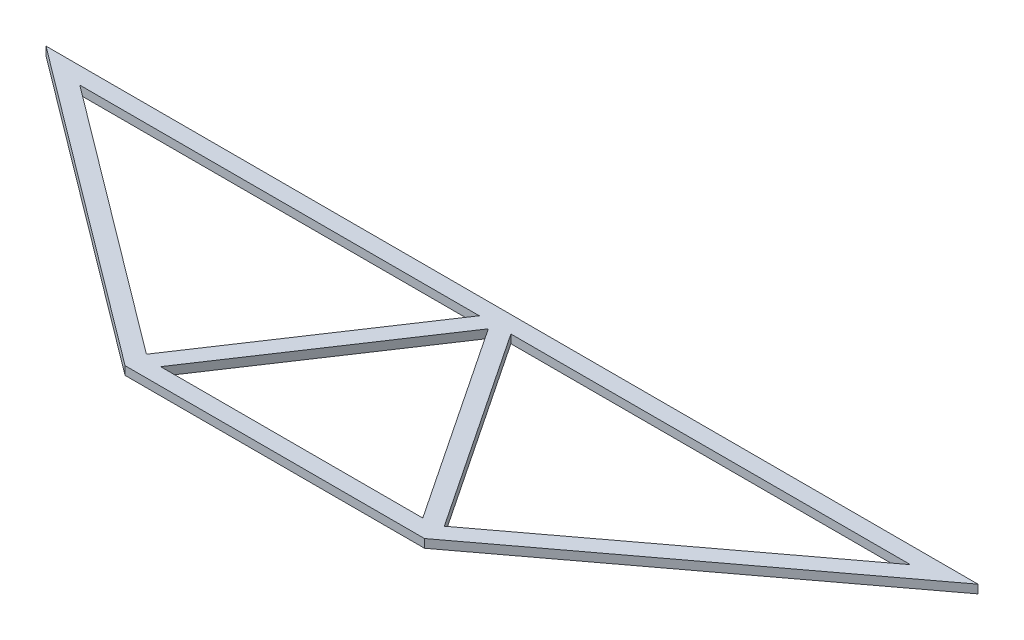
ISO-10303-21;
HEADER;
FILE_DESCRIPTION(('STEP AP214'),'2;1');
FILE_NAME('part.step','',(''),(''),'','','');
FILE_SCHEMA(('AUTOMOTIVE_DESIGN { 1 0 10303 214 1 1 1 1 }'));
ENDSEC;
DATA;
#1=APPLICATION_CONTEXT('core data for automotive mechanical design processes');
#2=APPLICATION_PROTOCOL_DEFINITION('international standard','automotive_design',2000,#1);
#3=PRODUCT_CONTEXT('',#1,'mechanical');
#4=PRODUCT('Part','Part','',(#3));
#5=PRODUCT_RELATED_PRODUCT_CATEGORY('part','',(#4));
#6=PRODUCT_DEFINITION_FORMATION('','',#4);
#7=PRODUCT_DEFINITION_CONTEXT('part definition',#1,'design');
#8=PRODUCT_DEFINITION('design','',#6,#7);
#9=PRODUCT_DEFINITION_SHAPE('','',#8);
#10=(LENGTH_UNIT() NAMED_UNIT(*) SI_UNIT(.MILLI.,.METRE.));
#11=(NAMED_UNIT(*) PLANE_ANGLE_UNIT() SI_UNIT($,.RADIAN.));
#12=(NAMED_UNIT(*) SI_UNIT($,.STERADIAN.) SOLID_ANGLE_UNIT());
#13=UNCERTAINTY_MEASURE_WITH_UNIT(LENGTH_MEASURE(1.E-05),#10,'distance_accuracy_value','');
#14=(GEOMETRIC_REPRESENTATION_CONTEXT(3) GLOBAL_UNCERTAINTY_ASSIGNED_CONTEXT((#13)) GLOBAL_UNIT_ASSIGNED_CONTEXT((#10,
#11,#12)) REPRESENTATION_CONTEXT('',''));
#15=CARTESIAN_POINT('',(0.,0.,0.));
#16=DIRECTION('',(0.,0.,1.));
#17=DIRECTION('',(1.,0.,0.));
#18=AXIS2_PLACEMENT_3D('',#15,#16,#17);
#19=CARTESIAN_POINT('',(0.,11.5,0.));
#20=DIRECTION('',(0.,-1.,0.));
#21=DIRECTION('',(0.,0.,-1.));
#22=AXIS2_PLACEMENT_3D('',#19,#20,#21);
#23=PLANE('',#22);
#24=DIRECTION('',(0.8,0.,-0.6));
#25=VECTOR('',#24,1.);
#26=CARTESIAN_POINT('',(403.833333333333,11.5,11.5));
#27=LINE('',#26,#25);
#28=CARTESIAN_POINT('',(403.833333333333,11.5,11.5));
#29=VERTEX_POINT('',#28);
#30=CARTESIAN_POINT('',(834.5,11.5,-311.5));
#31=VERTEX_POINT('',#30);
#32=EDGE_CURVE('E277',#29,#31,#27,.T.);
#33=ORIENTED_EDGE('',*,*,#32,.T.);
#34=DIRECTION('',(-1.,0.,0.));
#35=VECTOR('',#34,1.);
#36=CARTESIAN_POINT('',(834.5,11.5,-311.5));
#37=LINE('',#36,#35);
#38=CARTESIAN_POINT('',(-434.5,11.5,-311.5));
#39=VERTEX_POINT('',#38);
#40=EDGE_CURVE('E281',#31,#39,#37,.T.);
#41=ORIENTED_EDGE('',*,*,#40,.T.);
#42=DIRECTION('',(0.8,0.,0.6));
#43=VECTOR('',#42,1.);
#44=CARTESIAN_POINT('',(-434.5,11.5,-311.5));
#45=LINE('',#44,#43);
#46=CARTESIAN_POINT('',(-3.83333333333338,11.5,11.5));
#47=VERTEX_POINT('',#46);
#48=EDGE_CURVE('E285',#39,#47,#45,.T.);
#49=ORIENTED_EDGE('',*,*,#48,.T.);
#50=DIRECTION('',(1.,0.,0.));
#51=VECTOR('',#50,1.);
#52=CARTESIAN_POINT('',(-3.83333333333338,11.5,11.5));
#53=LINE('',#52,#51);
#54=EDGE_CURVE('E288',#47,#29,#53,.T.);
#55=ORIENTED_EDGE('',*,*,#54,.T.);
#56=EDGE_LOOP('',(#33,#41,#49,#55));
#57=FACE_BOUND('',#56,.T.);
#58=DIRECTION('',(0.55470019622523,0.,-0.832050294337843));
#59=VECTOR('',#58,1.);
#60=CARTESIAN_POINT('',(9.56857838488518,11.5,6.37905225659013));
#61=LINE('',#60,#59);
#62=CARTESIAN_POINT('',(21.4879465559453,11.5,-11.5));
#63=VERTEX_POINT('',#62);
#64=CARTESIAN_POINT('',(200.,11.5,-279.268080166082));
#65=VERTEX_POINT('',#64);
#66=EDGE_CURVE('E210',#63,#65,#61,.T.);
#67=ORIENTED_EDGE('',*,*,#66,.T.);
#68=DIRECTION('',(-0.554700196225229,0.,-0.832050294337843));
#69=VECTOR('',#68,1.);
#70=CARTESIAN_POINT('',(267.354498538192,11.5,-178.236332358795));
#71=LINE('',#70,#69);
#72=CARTESIAN_POINT('',(378.512053444055,11.5,-11.5));
#73=VERTEX_POINT('',#72);
#74=EDGE_CURVE('E248',#73,#65,#71,.T.);
#75=ORIENTED_EDGE('',*,*,#74,.F.);
#76=DIRECTION('',(-1.,0.,0.));
#77=VECTOR('',#76,1.);
#78=CARTESIAN_POINT('',(0.,11.5,-11.5));
#79=LINE('',#78,#77);
#80=EDGE_CURVE('E272',#73,#63,#79,.T.);
#81=ORIENTED_EDGE('',*,*,#80,.T.);
#82=EDGE_LOOP('',(#67,#75,#81));
#83=FACE_BOUND('',#82,.T.);
#84=DIRECTION('',(1.,0.,0.));
#85=VECTOR('',#84,1.);
#86=CARTESIAN_POINT('',(0.,11.5,-288.5));
#87=LINE('',#86,#85);
#88=CARTESIAN_POINT('',(-365.5,11.5,-288.5));
#89=VERTEX_POINT('',#88);
#90=CARTESIAN_POINT('',(178.512053444055,11.5,-288.5));
#91=VERTEX_POINT('',#90);
#92=EDGE_CURVE('E182',#89,#91,#87,.T.);
#93=ORIENTED_EDGE('',*,*,#92,.T.);
#94=DIRECTION('',(0.554700196225229,0.,-0.832050294337844));
#95=VECTOR('',#94,1.);
#96=CARTESIAN_POINT('',(-9.56857838488519,11.5,-6.37905225659013));
#97=LINE('',#96,#95);
#98=CARTESIAN_POINT('',(-2.82529770396354,11.5,-16.4939732779725));
#99=VERTEX_POINT('',#98);
#100=EDGE_CURVE('E202',#99,#91,#97,.T.);
#101=ORIENTED_EDGE('',*,*,#100,.F.);
#102=DIRECTION('',(-0.8,0.,-0.6));
#103=VECTOR('',#102,1.);
#104=CARTESIAN_POINT('',(6.89999999999994,11.5,-9.19999999999992));
#105=LINE('',#104,#103);
#106=EDGE_CURVE('E244',#99,#89,#105,.T.);
#107=ORIENTED_EDGE('',*,*,#106,.T.);
#108=EDGE_LOOP('',(#93,#101,#107));
#109=FACE_BOUND('',#108,.T.);
#110=DIRECTION('',(-0.8,0.,0.6));
#111=VECTOR('',#110,1.);
#112=CARTESIAN_POINT('',(402.825297703964,11.5,-16.4939732779726));
#113=LINE('',#112,#111);
#114=CARTESIAN_POINT('',(765.5,11.5,-288.5));
#115=VERTEX_POINT('',#114);
#116=CARTESIAN_POINT('',(402.825297703964,11.5,-16.4939732779726));
#117=VERTEX_POINT('',#116);
#118=EDGE_CURVE('E236',#115,#117,#113,.T.);
#119=ORIENTED_EDGE('',*,*,#118,.T.);
#120=DIRECTION('',(-0.55470019622523,0.,-0.832050294337843));
#121=VECTOR('',#120,1.);
#122=CARTESIAN_POINT('',(221.487946555945,11.5,-288.5));
#123=LINE('',#122,#121);
#124=CARTESIAN_POINT('',(221.487946555945,11.5,-288.5));
#125=VERTEX_POINT('',#124);
#126=EDGE_CURVE('E211',#117,#125,#123,.T.);
#127=ORIENTED_EDGE('',*,*,#126,.T.);
#128=DIRECTION('',(1.,0.,0.));
#129=VECTOR('',#128,1.);
#130=CARTESIAN_POINT('',(765.5,11.5,-288.5));
#131=LINE('',#130,#129);
#132=EDGE_CURVE('E240',#125,#115,#131,.T.);
#133=ORIENTED_EDGE('',*,*,#132,.T.);
#134=EDGE_LOOP('',(#119,#127,#133));
#135=FACE_BOUND('',#134,.T.);
#136=ADVANCED_FACE('F81',(#57,#83,#109,#135),#23,.F.);
#137=CARTESIAN_POINT('',(0.,0.,0.));
#138=DIRECTION('',(0.,-1.,0.));
#139=DIRECTION('',(0.,0.,-1.));
#140=AXIS2_PLACEMENT_3D('',#137,#138,#139);
#141=PLANE('',#140);
#142=DIRECTION('',(-0.554700196225229,0.,0.832050294337844));
#143=VECTOR('',#142,1.);
#144=CARTESIAN_POINT('',(-9.56857838488519,0.,-6.37905225659013));
#145=LINE('',#144,#143);
#146=CARTESIAN_POINT('',(178.512053444055,0.,-288.5));
#147=VERTEX_POINT('',#146);
#148=CARTESIAN_POINT('',(-2.82529770396354,0.,-16.4939732779725));
#149=VERTEX_POINT('',#148);
#150=EDGE_CURVE('E198',#147,#149,#145,.T.);
#151=ORIENTED_EDGE('',*,*,#150,.F.);
#152=DIRECTION('',(-1.,0.,0.));
#153=VECTOR('',#152,1.);
#154=CARTESIAN_POINT('',(0.,0.,-288.5));
#155=LINE('',#154,#153);
#156=CARTESIAN_POINT('',(-365.5,0.,-288.5));
#157=VERTEX_POINT('',#156);
#158=EDGE_CURVE('E179',#147,#157,#155,.T.);
#159=ORIENTED_EDGE('',*,*,#158,.T.);
#160=DIRECTION('',(0.8,0.,0.6));
#161=VECTOR('',#160,1.);
#162=CARTESIAN_POINT('',(6.89999999999994,0.,-9.19999999999992));
#163=LINE('',#162,#161);
#164=EDGE_CURVE('E190',#157,#149,#163,.T.);
#165=ORIENTED_EDGE('',*,*,#164,.T.);
#166=EDGE_LOOP('',(#151,#159,#165));
#167=FACE_BOUND('',#166,.T.);
#168=DIRECTION('',(0.554700196225229,0.,0.832050294337844));
#169=VECTOR('',#168,1.);
#170=CARTESIAN_POINT('',(267.354498538192,0.,-178.236332358795));
#171=LINE('',#170,#169);
#172=CARTESIAN_POINT('',(200.,0.,-279.268080166082));
#173=VERTEX_POINT('',#172);
#174=CARTESIAN_POINT('',(378.512053444055,0.,-11.5));
#175=VERTEX_POINT('',#174);
#176=EDGE_CURVE('E251',#173,#175,#171,.T.);
#177=ORIENTED_EDGE('',*,*,#176,.F.);
#178=DIRECTION('',(-0.554700196225229,0.,0.832050294337843));
#179=VECTOR('',#178,1.);
#180=CARTESIAN_POINT('',(9.56857838488518,0.,6.37905225659013));
#181=LINE('',#180,#179);
#182=CARTESIAN_POINT('',(21.4879465559453,0.,-11.5));
#183=VERTEX_POINT('',#182);
#184=EDGE_CURVE('E254',#173,#183,#181,.T.);
#185=ORIENTED_EDGE('',*,*,#184,.T.);
#186=DIRECTION('',(1.,0.,0.));
#187=VECTOR('',#186,1.);
#188=CARTESIAN_POINT('',(0.,0.,-11.5));
#189=LINE('',#188,#187);
#190=EDGE_CURVE('E258',#183,#175,#189,.T.);
#191=ORIENTED_EDGE('',*,*,#190,.T.);
#192=EDGE_LOOP('',(#177,#185,#191));
#193=FACE_BOUND('',#192,.T.);
#194=DIRECTION('',(0.8,0.,-0.6));
#195=VECTOR('',#194,1.);
#196=CARTESIAN_POINT('',(403.833333333333,0.,11.5));
#197=LINE('',#196,#195);
#198=CARTESIAN_POINT('',(403.833333333333,0.,11.5));
#199=VERTEX_POINT('',#198);
#200=CARTESIAN_POINT('',(834.5,0.,-311.5));
#201=VERTEX_POINT('',#200);
#202=EDGE_CURVE('E276',#199,#201,#197,.T.);
#203=ORIENTED_EDGE('',*,*,#202,.F.);
#204=DIRECTION('',(1.,0.,0.));
#205=VECTOR('',#204,1.);
#206=CARTESIAN_POINT('',(-3.83333333333338,0.,11.5));
#207=LINE('',#206,#205);
#208=CARTESIAN_POINT('',(-3.83333333333338,0.,11.5));
#209=VERTEX_POINT('',#208);
#210=EDGE_CURVE('E282',#209,#199,#207,.T.);
#211=ORIENTED_EDGE('',*,*,#210,.F.);
#212=DIRECTION('',(0.8,0.,0.6));
#213=VECTOR('',#212,1.);
#214=CARTESIAN_POINT('',(-434.5,0.,-311.5));
#215=LINE('',#214,#213);
#216=CARTESIAN_POINT('',(-434.5,0.,-311.5));
#217=VERTEX_POINT('',#216);
#218=EDGE_CURVE('E298',#217,#209,#215,.T.);
#219=ORIENTED_EDGE('',*,*,#218,.F.);
#220=DIRECTION('',(-1.,0.,0.));
#221=VECTOR('',#220,1.);
#222=CARTESIAN_POINT('',(834.5,0.,-311.5));
#223=LINE('',#222,#221);
#224=EDGE_CURVE('E295',#201,#217,#223,.T.);
#225=ORIENTED_EDGE('',*,*,#224,.F.);
#226=EDGE_LOOP('',(#203,#211,#219,#225));
#227=FACE_BOUND('',#226,.T.);
#228=DIRECTION('',(0.554700196225229,0.,0.832050294337843));
#229=VECTOR('',#228,1.);
#230=CARTESIAN_POINT('',(221.487946555945,0.,-288.5));
#231=LINE('',#230,#229);
#232=CARTESIAN_POINT('',(221.487946555945,0.,-288.5));
#233=VERTEX_POINT('',#232);
#234=CARTESIAN_POINT('',(402.825297703964,0.,-16.4939732779726));
#235=VERTEX_POINT('',#234);
#236=EDGE_CURVE('E224',#233,#235,#231,.T.);
#237=ORIENTED_EDGE('',*,*,#236,.T.);
#238=DIRECTION('',(0.8,0.,-0.6));
#239=VECTOR('',#238,1.);
#240=CARTESIAN_POINT('',(402.825297703964,0.,-16.4939732779726));
#241=LINE('',#240,#239);
#242=CARTESIAN_POINT('',(765.5,0.,-288.5));
#243=VERTEX_POINT('',#242);
#244=EDGE_CURVE('E232',#235,#243,#241,.T.);
#245=ORIENTED_EDGE('',*,*,#244,.T.);
#246=DIRECTION('',(-1.,0.,0.));
#247=VECTOR('',#246,1.);
#248=CARTESIAN_POINT('',(765.5,0.,-288.5));
#249=LINE('',#248,#247);
#250=EDGE_CURVE('E228',#243,#233,#249,.T.);
#251=ORIENTED_EDGE('',*,*,#250,.T.);
#252=EDGE_LOOP('',(#237,#245,#251));
#253=FACE_BOUND('',#252,.T.);
#254=ADVANCED_FACE('F196',(#167,#193,#227,#253),#141,.T.);
#255=CARTESIAN_POINT('',(403.833333333333,11.5,11.5));
#256=DIRECTION('',(-0.6,0.,-0.8));
#257=DIRECTION('',(-0.8,0.,0.6));
#258=AXIS2_PLACEMENT_3D('',#255,#256,#257);
#259=PLANE('',#258);
#260=ORIENTED_EDGE('',*,*,#202,.T.);
#261=DIRECTION('',(0.,-1.,0.));
#262=VECTOR('',#261,1.);
#263=CARTESIAN_POINT('',(834.5,11.5,-311.5));
#264=LINE('',#263,#262);
#265=EDGE_CURVE('E12',#31,#201,#264,.T.);
#266=ORIENTED_EDGE('',*,*,#265,.F.);
#267=ORIENTED_EDGE('',*,*,#32,.F.);
#268=DIRECTION('',(0.,-1.,0.));
#269=VECTOR('',#268,1.);
#270=CARTESIAN_POINT('',(403.833333333333,11.5,11.5));
#271=LINE('',#270,#269);
#272=EDGE_CURVE('E291',#29,#199,#271,.T.);
#273=ORIENTED_EDGE('',*,*,#272,.T.);
#274=EDGE_LOOP('',(#260,#266,#267,#273));
#275=FACE_BOUND('',#274,.T.);
#276=ADVANCED_FACE('F83',(#275),#259,.F.);
#277=CARTESIAN_POINT('',(834.5,11.5,-311.5));
#278=DIRECTION('',(0.,0.,1.));
#279=DIRECTION('',(1.,0.,0.));
#280=AXIS2_PLACEMENT_3D('',#277,#278,#279);
#281=PLANE('',#280);
#282=ORIENTED_EDGE('',*,*,#224,.T.);
#283=DIRECTION('',(0.,-1.,0.));
#284=VECTOR('',#283,1.);
#285=CARTESIAN_POINT('',(-434.5,11.5,-311.5));
#286=LINE('',#285,#284);
#287=EDGE_CURVE('E90',#39,#217,#286,.T.);
#288=ORIENTED_EDGE('',*,*,#287,.F.);
#289=ORIENTED_EDGE('',*,*,#40,.F.);
#290=ORIENTED_EDGE('',*,*,#265,.T.);
#291=EDGE_LOOP('',(#282,#288,#289,#290));
#292=FACE_BOUND('',#291,.T.);
#293=ADVANCED_FACE('F331',(#292),#281,.F.);
#294=CARTESIAN_POINT('',(-434.5,11.5,-311.5));
#295=DIRECTION('',(0.6,0.,-0.8));
#296=DIRECTION('',(-0.8,0.,-0.6));
#297=AXIS2_PLACEMENT_3D('',#294,#295,#296);
#298=PLANE('',#297);
#299=ORIENTED_EDGE('',*,*,#218,.T.);
#300=DIRECTION('',(0.,-1.,0.));
#301=VECTOR('',#300,1.);
#302=CARTESIAN_POINT('',(-3.83333333333338,11.5,11.5));
#303=LINE('',#302,#301);
#304=EDGE_CURVE('E306',#47,#209,#303,.T.);
#305=ORIENTED_EDGE('',*,*,#304,.F.);
#306=ORIENTED_EDGE('',*,*,#48,.F.);
#307=ORIENTED_EDGE('',*,*,#287,.T.);
#308=EDGE_LOOP('',(#299,#305,#306,#307));
#309=FACE_BOUND('',#308,.T.);
#310=ADVANCED_FACE('F315',(#309),#298,.F.);
#311=CARTESIAN_POINT('',(-3.83333333333338,11.5,11.5));
#312=DIRECTION('',(0.,0.,-1.));
#313=DIRECTION('',(-1.,0.,0.));
#314=AXIS2_PLACEMENT_3D('',#311,#312,#313);
#315=PLANE('',#314);
#316=ORIENTED_EDGE('',*,*,#210,.T.);
#317=ORIENTED_EDGE('',*,*,#272,.F.);
#318=ORIENTED_EDGE('',*,*,#54,.F.);
#319=ORIENTED_EDGE('',*,*,#304,.T.);
#320=EDGE_LOOP('',(#316,#317,#318,#319));
#321=FACE_BOUND('',#320,.T.);
#322=ADVANCED_FACE('F324',(#321),#315,.F.);
#323=CARTESIAN_POINT('',(267.354498538192,11.501,-178.236332358795));
#324=DIRECTION('',(0.832050294337843,0.,-0.554700196225229));
#325=DIRECTION('',(-0.554700196225229,0.,-0.832050294337843));
#326=AXIS2_PLACEMENT_3D('',#323,#324,#325);
#327=PLANE('',#326);
#328=ORIENTED_EDGE('',*,*,#74,.T.);
#329=DIRECTION('',(0.,-1.,0.));
#330=VECTOR('',#329,1.);
#331=CARTESIAN_POINT('',(200.,11.501,-279.268080166082));
#332=LINE('',#331,#330);
#333=EDGE_CURVE('E269',#65,#173,#332,.T.);
#334=ORIENTED_EDGE('',*,*,#333,.T.);
#335=ORIENTED_EDGE('',*,*,#176,.T.);
#336=DIRECTION('',(0.,-1.,0.));
#337=VECTOR('',#336,1.);
#338=CARTESIAN_POINT('',(378.512053444055,11.501,-11.5));
#339=LINE('',#338,#337);
#340=EDGE_CURVE('E262',#73,#175,#339,.T.);
#341=ORIENTED_EDGE('',*,*,#340,.F.);
#342=EDGE_LOOP('',(#328,#334,#335,#341));
#343=FACE_BOUND('',#342,.T.);
#344=ADVANCED_FACE('F346',(#343),#327,.F.);
#345=CARTESIAN_POINT('',(9.56857838488518,11.501,6.37905225659013));
#346=DIRECTION('',(0.832050294337843,0.,0.554700196225229));
#347=DIRECTION('',(0.55470019622523,0.,-0.832050294337843));
#348=AXIS2_PLACEMENT_3D('',#345,#346,#347);
#349=PLANE('',#348);
#350=DIRECTION('',(0.,-1.,0.));
#351=VECTOR('',#350,1.);
#352=CARTESIAN_POINT('',(21.4879465559453,11.501,-11.5));
#353=LINE('',#352,#351);
#354=EDGE_CURVE('E266',#63,#183,#353,.T.);
#355=ORIENTED_EDGE('',*,*,#354,.T.);
#356=ORIENTED_EDGE('',*,*,#184,.F.);
#357=ORIENTED_EDGE('',*,*,#333,.F.);
#358=ORIENTED_EDGE('',*,*,#66,.F.);
#359=EDGE_LOOP('',(#355,#356,#357,#358));
#360=FACE_BOUND('',#359,.T.);
#361=ADVANCED_FACE('F352',(#360),#349,.T.);
#362=CARTESIAN_POINT('',(0.,11.501,-11.5));
#363=DIRECTION('',(0.,0.,-1.));
#364=DIRECTION('',(-1.,0.,0.));
#365=AXIS2_PLACEMENT_3D('',#362,#363,#364);
#366=PLANE('',#365);
#367=ORIENTED_EDGE('',*,*,#340,.T.);
#368=ORIENTED_EDGE('',*,*,#190,.F.);
#369=ORIENTED_EDGE('',*,*,#354,.F.);
#370=ORIENTED_EDGE('',*,*,#80,.F.);
#371=EDGE_LOOP('',(#367,#368,#369,#370));
#372=FACE_BOUND('',#371,.T.);
#373=ADVANCED_FACE('F357',(#372),#366,.T.);
#374=CARTESIAN_POINT('',(-9.56857838488519,11.501,-6.37905225659013));
#375=DIRECTION('',(0.832050294337844,0.,0.554700196225229));
#376=DIRECTION('',(0.554700196225229,0.,-0.832050294337844));
#377=AXIS2_PLACEMENT_3D('',#374,#375,#376);
#378=PLANE('',#377);
#379=ORIENTED_EDGE('',*,*,#100,.T.);
#380=DIRECTION('',(0.,-1.,0.));
#381=VECTOR('',#380,1.);
#382=CARTESIAN_POINT('',(178.512053444055,11.501,-288.5));
#383=LINE('',#382,#381);
#384=EDGE_CURVE('E186',#91,#147,#383,.T.);
#385=ORIENTED_EDGE('',*,*,#384,.T.);
#386=ORIENTED_EDGE('',*,*,#150,.T.);
#387=DIRECTION('',(0.,-1.,0.));
#388=VECTOR('',#387,1.);
#389=CARTESIAN_POINT('',(-2.82529770396354,11.501,-16.4939732779725));
#390=LINE('',#389,#388);
#391=EDGE_CURVE('E185',#99,#149,#390,.T.);
#392=ORIENTED_EDGE('',*,*,#391,.F.);
#393=EDGE_LOOP('',(#379,#385,#386,#392));
#394=FACE_BOUND('',#393,.T.);
#395=ADVANCED_FACE('F369',(#394),#378,.F.);
#396=CARTESIAN_POINT('',(0.,11.501,-288.5));
#397=DIRECTION('',(0.,0.,1.));
#398=DIRECTION('',(1.,0.,0.));
#399=AXIS2_PLACEMENT_3D('',#396,#397,#398);
#400=PLANE('',#399);
#401=DIRECTION('',(0.,-1.,0.));
#402=VECTOR('',#401,1.);
#403=CARTESIAN_POINT('',(-365.5,11.501,-288.5));
#404=LINE('',#403,#402);
#405=EDGE_CURVE('E105',#89,#157,#404,.T.);
#406=ORIENTED_EDGE('',*,*,#405,.T.);
#407=ORIENTED_EDGE('',*,*,#158,.F.);
#408=ORIENTED_EDGE('',*,*,#384,.F.);
#409=ORIENTED_EDGE('',*,*,#92,.F.);
#410=EDGE_LOOP('',(#406,#407,#408,#409));
#411=FACE_BOUND('',#410,.T.);
#412=ADVANCED_FACE('F176',(#411),#400,.T.);
#413=CARTESIAN_POINT('',(6.89999999999994,11.501,-9.19999999999992));
#414=DIRECTION('',(0.6,0.,-0.8));
#415=DIRECTION('',(-0.8,0.,-0.6));
#416=AXIS2_PLACEMENT_3D('',#413,#414,#415);
#417=PLANE('',#416);
#418=ORIENTED_EDGE('',*,*,#391,.T.);
#419=ORIENTED_EDGE('',*,*,#164,.F.);
#420=ORIENTED_EDGE('',*,*,#405,.F.);
#421=ORIENTED_EDGE('',*,*,#106,.F.);
#422=EDGE_LOOP('',(#418,#419,#420,#421));
#423=FACE_BOUND('',#422,.T.);
#424=ADVANCED_FACE('F191',(#423),#417,.T.);
#425=CARTESIAN_POINT('',(402.825297703964,11.501,-16.4939732779726));
#426=DIRECTION('',(-0.6,0.,-0.8));
#427=DIRECTION('',(-0.8,0.,0.6));
#428=AXIS2_PLACEMENT_3D('',#425,#426,#427);
#429=PLANE('',#428);
#430=DIRECTION('',(0.,-1.,0.));
#431=VECTOR('',#430,1.);
#432=CARTESIAN_POINT('',(765.5,11.501,-288.5));
#433=LINE('',#432,#431);
#434=EDGE_CURVE('E215',#115,#243,#433,.T.);
#435=ORIENTED_EDGE('',*,*,#434,.T.);
#436=ORIENTED_EDGE('',*,*,#244,.F.);
#437=DIRECTION('',(0.,-1.,0.));
#438=VECTOR('',#437,1.);
#439=CARTESIAN_POINT('',(402.825297703964,11.501,-16.4939732779726));
#440=LINE('',#439,#438);
#441=EDGE_CURVE('E220',#117,#235,#440,.T.);
#442=ORIENTED_EDGE('',*,*,#441,.F.);
#443=ORIENTED_EDGE('',*,*,#118,.F.);
#444=EDGE_LOOP('',(#435,#436,#442,#443));
#445=FACE_BOUND('',#444,.T.);
#446=ADVANCED_FACE('F383',(#445),#429,.T.);
#447=CARTESIAN_POINT('',(765.5,11.501,-288.5));
#448=DIRECTION('',(0.,0.,1.));
#449=DIRECTION('',(1.,0.,0.));
#450=AXIS2_PLACEMENT_3D('',#447,#448,#449);
#451=PLANE('',#450);
#452=DIRECTION('',(0.,-1.,0.));
#453=VECTOR('',#452,1.);
#454=CARTESIAN_POINT('',(221.487946555945,11.501,-288.5));
#455=LINE('',#454,#453);
#456=EDGE_CURVE('E97',#125,#233,#455,.T.);
#457=ORIENTED_EDGE('',*,*,#456,.T.);
#458=ORIENTED_EDGE('',*,*,#250,.F.);
#459=ORIENTED_EDGE('',*,*,#434,.F.);
#460=ORIENTED_EDGE('',*,*,#132,.F.);
#461=EDGE_LOOP('',(#457,#458,#459,#460));
#462=FACE_BOUND('',#461,.T.);
#463=ADVANCED_FACE('F380',(#462),#451,.T.);
#464=CARTESIAN_POINT('',(221.487946555945,11.501,-288.5));
#465=DIRECTION('',(0.832050294337843,0.,-0.554700196225229));
#466=DIRECTION('',(-0.55470019622523,0.,-0.832050294337843));
#467=AXIS2_PLACEMENT_3D('',#464,#465,#466);
#468=PLANE('',#467);
#469=ORIENTED_EDGE('',*,*,#441,.T.);
#470=ORIENTED_EDGE('',*,*,#236,.F.);
#471=ORIENTED_EDGE('',*,*,#456,.F.);
#472=ORIENTED_EDGE('',*,*,#126,.F.);
#473=EDGE_LOOP('',(#469,#470,#471,#472));
#474=FACE_BOUND('',#473,.T.);
#475=ADVANCED_FACE('F377',(#474),#468,.T.);
#476=CLOSED_SHELL('',(#136,#254,#276,#293,#310,#322,#344,#361,#373,#395,#412,#424,#446,#463,#475));
#477=MANIFOLD_SOLID_BREP('B2',#476);
#478=ADVANCED_BREP_SHAPE_REPRESENTATION('',(#18,#477),#14);
#479=SHAPE_DEFINITION_REPRESENTATION(#9,#478);
ENDSEC;
END-ISO-10303-21;
